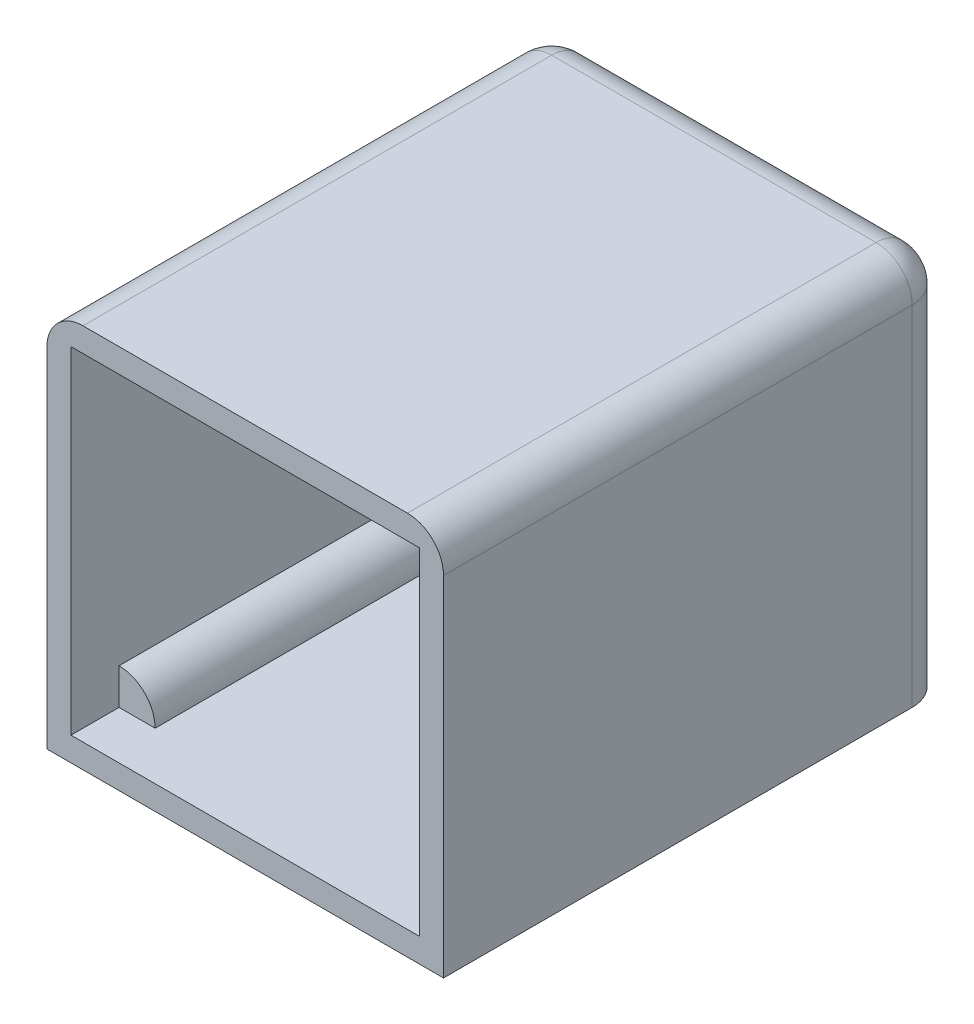
ISO-10303-21;
HEADER;
FILE_DESCRIPTION(('STEP AP214'),'2;1');
FILE_NAME('part.step','',(''),(''),'','','');
FILE_SCHEMA(('AUTOMOTIVE_DESIGN { 1 0 10303 214 1 1 1 1 }'));
ENDSEC;
DATA;
#1=APPLICATION_CONTEXT('core data for automotive mechanical design processes');
#2=APPLICATION_PROTOCOL_DEFINITION('international standard','automotive_design',2000,#1);
#3=PRODUCT_CONTEXT('',#1,'mechanical');
#4=PRODUCT('Part','Part','',(#3));
#5=PRODUCT_RELATED_PRODUCT_CATEGORY('part','',(#4));
#6=PRODUCT_DEFINITION_FORMATION('','',#4);
#7=PRODUCT_DEFINITION_CONTEXT('part definition',#1,'design');
#8=PRODUCT_DEFINITION('design','',#6,#7);
#9=PRODUCT_DEFINITION_SHAPE('','',#8);
#10=(LENGTH_UNIT() NAMED_UNIT(*) SI_UNIT(.MILLI.,.METRE.));
#11=(NAMED_UNIT(*) PLANE_ANGLE_UNIT() SI_UNIT($,.RADIAN.));
#12=(NAMED_UNIT(*) SI_UNIT($,.STERADIAN.) SOLID_ANGLE_UNIT());
#13=UNCERTAINTY_MEASURE_WITH_UNIT(LENGTH_MEASURE(1.E-05),#10,'distance_accuracy_value','');
#14=(GEOMETRIC_REPRESENTATION_CONTEXT(3) GLOBAL_UNCERTAINTY_ASSIGNED_CONTEXT((#13)) GLOBAL_UNIT_ASSIGNED_CONTEXT((#10,
#11,#12)) REPRESENTATION_CONTEXT('',''));
#15=CARTESIAN_POINT('',(0.,0.,0.));
#16=DIRECTION('',(0.,0.,1.));
#17=DIRECTION('',(1.,0.,0.));
#18=AXIS2_PLACEMENT_3D('',#15,#16,#17);
#19=CARTESIAN_POINT('',(-13.0571972328708,0.,1.));
#20=DIRECTION('',(0.,-1.,0.));
#21=DIRECTION('',(0.,0.,-1.));
#22=AXIS2_PLACEMENT_3D('',#19,#20,#21);
#23=CYLINDRICAL_SURFACE('',#22,3.);
#24=CARTESIAN_POINT('',(-13.0571972328708,9.65690552425284,1.));
#25=DIRECTION('',(0.,1.,0.));
#26=DIRECTION('',(0.,0.,1.));
#27=AXIS2_PLACEMENT_3D('',#24,#25,#26);
#28=CIRCLE('',#27,3.);
#29=CARTESIAN_POINT('',(-13.0571972328708,9.65690552425284,-2.));
#30=VERTEX_POINT('',#29);
#31=CARTESIAN_POINT('',(-16.0571972328708,9.65690552425284,1.));
#32=VERTEX_POINT('',#31);
#33=EDGE_CURVE('E12',#30,#32,#28,.T.);
#34=ORIENTED_EDGE('',*,*,#33,.F.);
#35=DIRECTION('',(0.,1.,0.));
#36=VECTOR('',#35,1.);
#37=CARTESIAN_POINT('',(-13.0571972328708,0.,-2.));
#38=LINE('',#37,#36);
#39=CARTESIAN_POINT('',(-13.0571972328708,-19.3430944757472,-2.));
#40=VERTEX_POINT('',#39);
#41=EDGE_CURVE('E298',#40,#30,#38,.T.);
#42=ORIENTED_EDGE('',*,*,#41,.F.);
#43=CARTESIAN_POINT('',(-13.0571972328708,-19.3430944757472,1.));
#44=DIRECTION('',(0.,1.,0.));
#45=DIRECTION('',(0.,0.,1.));
#46=AXIS2_PLACEMENT_3D('',#43,#44,#45);
#47=CIRCLE('',#46,3.);
#48=CARTESIAN_POINT('',(-16.0571972328708,-19.3430944757472,0.999999999999994));
#49=VERTEX_POINT('',#48);
#50=EDGE_CURVE('E52',#49,#40,#47,.F.);
#51=ORIENTED_EDGE('',*,*,#50,.F.);
#52=DIRECTION('',(0.,1.,0.));
#53=VECTOR('',#52,1.);
#54=CARTESIAN_POINT('',(-16.0571972328708,0.,1.));
#55=LINE('',#54,#53);
#56=EDGE_CURVE('E301',#32,#49,#55,.F.);
#57=ORIENTED_EDGE('',*,*,#56,.F.);
#58=EDGE_LOOP('',(#34,#42,#51,#57));
#59=FACE_BOUND('',#58,.T.);
#60=ADVANCED_FACE('F37',(#59),#23,.T.);
#61=CARTESIAN_POINT('',(-13.0571972328708,9.65690552425284,1.));
#62=DIRECTION('',(0.,0.,1.));
#63=DIRECTION('',(1.,0.,0.));
#64=AXIS2_PLACEMENT_3D('',#61,#62,#63);
#65=SPHERICAL_SURFACE('',#64,3.);
#66=CARTESIAN_POINT('',(-13.0571972328708,9.65690552425284,1.));
#67=DIRECTION('',(1.,0.,0.));
#68=DIRECTION('',(0.,0.,-1.));
#69=AXIS2_PLACEMENT_3D('',#66,#67,#68);
#70=CIRCLE('',#69,3.);
#71=CARTESIAN_POINT('',(-13.0571972328708,12.6569055242528,1.));
#72=VERTEX_POINT('',#71);
#73=EDGE_CURVE('E304',#30,#72,#70,.T.);
#74=ORIENTED_EDGE('',*,*,#73,.F.);
#75=ORIENTED_EDGE('',*,*,#33,.T.);
#76=CARTESIAN_POINT('',(-13.0571972328708,9.65690552425284,1.));
#77=DIRECTION('',(0.,0.,1.));
#78=DIRECTION('',(1.,0.,0.));
#79=AXIS2_PLACEMENT_3D('',#76,#77,#78);
#80=CIRCLE('',#79,3.);
#81=EDGE_CURVE('E45',#72,#32,#80,.T.);
#82=ORIENTED_EDGE('',*,*,#81,.F.);
#83=EDGE_LOOP('',(#74,#75,#82));
#84=FACE_BOUND('',#83,.T.);
#85=ADVANCED_FACE('F39',(#84),#65,.T.);
#86=CARTESIAN_POINT('',(13.9428027671292,12.6569055242528,1.));
#87=DIRECTION('',(0.,-1.,0.));
#88=DIRECTION('',(0.,0.,-1.));
#89=AXIS2_PLACEMENT_3D('',#86,#87,#88);
#90=CYLINDRICAL_SURFACE('',#89,3.);
#91=CARTESIAN_POINT('',(13.9428027671292,9.65690552425284,1.));
#92=DIRECTION('',(0.,1.,0.));
#93=DIRECTION('',(0.,0.,1.));
#94=AXIS2_PLACEMENT_3D('',#91,#92,#93);
#95=CIRCLE('',#94,3.);
#96=CARTESIAN_POINT('',(16.9428027671292,9.65690552425284,1.));
#97=VERTEX_POINT('',#96);
#98=CARTESIAN_POINT('',(13.9428027671292,9.65690552425284,-2.));
#99=VERTEX_POINT('',#98);
#100=EDGE_CURVE('E295',#97,#99,#95,.T.);
#101=ORIENTED_EDGE('',*,*,#100,.F.);
#102=DIRECTION('',(0.,1.,0.));
#103=VECTOR('',#102,1.);
#104=CARTESIAN_POINT('',(16.9428027671292,12.6569055242528,1.));
#105=LINE('',#104,#103);
#106=CARTESIAN_POINT('',(16.9428027671292,-19.3430944757472,0.999999999999994));
#107=VERTEX_POINT('',#106);
#108=EDGE_CURVE('E281',#107,#97,#105,.T.);
#109=ORIENTED_EDGE('',*,*,#108,.F.);
#110=CARTESIAN_POINT('',(13.9428027671292,-19.3430944757472,1.));
#111=DIRECTION('',(0.,1.,0.));
#112=DIRECTION('',(0.,0.,1.));
#113=AXIS2_PLACEMENT_3D('',#110,#111,#112);
#114=CIRCLE('',#113,3.);
#115=CARTESIAN_POINT('',(13.9428027671292,-19.3430944757472,-2.));
#116=VERTEX_POINT('',#115);
#117=EDGE_CURVE('E287',#116,#107,#114,.F.);
#118=ORIENTED_EDGE('',*,*,#117,.F.);
#119=DIRECTION('',(0.,1.,0.));
#120=VECTOR('',#119,1.);
#121=CARTESIAN_POINT('',(13.9428027671292,12.6569055242528,-2.));
#122=LINE('',#121,#120);
#123=EDGE_CURVE('E284',#99,#116,#122,.F.);
#124=ORIENTED_EDGE('',*,*,#123,.F.);
#125=EDGE_LOOP('',(#101,#109,#118,#124));
#126=FACE_BOUND('',#125,.T.);
#127=ADVANCED_FACE('F470',(#126),#90,.T.);
#128=CARTESIAN_POINT('',(13.9428027671292,9.65690552425284,1.));
#129=DIRECTION('',(0.,0.,1.));
#130=DIRECTION('',(1.,0.,0.));
#131=AXIS2_PLACEMENT_3D('',#128,#129,#130);
#132=SPHERICAL_SURFACE('',#131,3.);
#133=CARTESIAN_POINT('',(13.9428027671292,9.65690552425284,1.));
#134=DIRECTION('',(0.,0.,-1.));
#135=DIRECTION('',(-1.,0.,0.));
#136=AXIS2_PLACEMENT_3D('',#133,#134,#135);
#137=CIRCLE('',#136,3.);
#138=CARTESIAN_POINT('',(13.9428027671292,12.6569055242528,1.));
#139=VERTEX_POINT('',#138);
#140=EDGE_CURVE('E289',#97,#139,#137,.F.);
#141=ORIENTED_EDGE('',*,*,#140,.F.);
#142=ORIENTED_EDGE('',*,*,#100,.T.);
#143=CARTESIAN_POINT('',(13.9428027671292,9.65690552425284,1.));
#144=DIRECTION('',(1.,0.,0.));
#145=DIRECTION('',(0.,0.,-1.));
#146=AXIS2_PLACEMENT_3D('',#143,#144,#145);
#147=CIRCLE('',#146,3.);
#148=EDGE_CURVE('E292',#139,#99,#147,.F.);
#149=ORIENTED_EDGE('',*,*,#148,.F.);
#150=EDGE_LOOP('',(#141,#142,#149));
#151=FACE_BOUND('',#150,.T.);
#152=ADVANCED_FACE('F472',(#151),#132,.T.);
#153=CARTESIAN_POINT('',(-16.0571972328708,9.65690552425284,1.));
#154=DIRECTION('',(1.,0.,0.));
#155=DIRECTION('',(0.,0.,-1.));
#156=AXIS2_PLACEMENT_3D('',#153,#154,#155);
#157=CYLINDRICAL_SURFACE('',#156,3.);
#158=DIRECTION('',(-1.,0.,0.));
#159=VECTOR('',#158,1.);
#160=CARTESIAN_POINT('',(-16.0571972328708,9.65690552425284,-2.));
#161=LINE('',#160,#159);
#162=EDGE_CURVE('E276',#30,#99,#161,.F.);
#163=ORIENTED_EDGE('',*,*,#162,.F.);
#164=ORIENTED_EDGE('',*,*,#73,.T.);
#165=DIRECTION('',(-1.,0.,0.));
#166=VECTOR('',#165,1.);
#167=CARTESIAN_POINT('',(-16.0571972328708,12.6569055242528,1.));
#168=LINE('',#167,#166);
#169=EDGE_CURVE('E263',#139,#72,#168,.T.);
#170=ORIENTED_EDGE('',*,*,#169,.F.);
#171=ORIENTED_EDGE('',*,*,#148,.T.);
#172=EDGE_LOOP('',(#163,#164,#170,#171));
#173=FACE_BOUND('',#172,.T.);
#174=ADVANCED_FACE('F325',(#173),#157,.T.);
#175=CARTESIAN_POINT('',(13.9428027671292,9.65690552425284,40.));
#176=DIRECTION('',(0.,0.,-1.));
#177=DIRECTION('',(-1.,0.,0.));
#178=AXIS2_PLACEMENT_3D('',#175,#176,#177);
#179=CYLINDRICAL_SURFACE('',#178,3.);
#180=DIRECTION('',(0.,0.,-1.));
#181=VECTOR('',#180,1.);
#182=CARTESIAN_POINT('',(16.9428027671292,9.65690552425284,40.));
#183=LINE('',#182,#181);
#184=CARTESIAN_POINT('',(16.9428027671292,9.65690552425284,40.));
#185=VERTEX_POINT('',#184);
#186=EDGE_CURVE('E269',#97,#185,#183,.F.);
#187=ORIENTED_EDGE('',*,*,#186,.F.);
#188=ORIENTED_EDGE('',*,*,#140,.T.);
#189=DIRECTION('',(0.,0.,-1.));
#190=VECTOR('',#189,1.);
#191=CARTESIAN_POINT('',(13.9428027671292,12.6569055242528,40.));
#192=LINE('',#191,#190);
#193=CARTESIAN_POINT('',(13.9428027671292,12.6569055242528,40.));
#194=VERTEX_POINT('',#193);
#195=EDGE_CURVE('E266',#194,#139,#192,.T.);
#196=ORIENTED_EDGE('',*,*,#195,.F.);
#197=CARTESIAN_POINT('',(13.9428027671292,9.65690552425284,40.));
#198=DIRECTION('',(0.,0.,-1.));
#199=DIRECTION('',(-1.,0.,0.));
#200=AXIS2_PLACEMENT_3D('',#197,#198,#199);
#201=CIRCLE('',#200,3.);
#202=EDGE_CURVE('E274',#185,#194,#201,.F.);
#203=ORIENTED_EDGE('',*,*,#202,.F.);
#204=EDGE_LOOP('',(#187,#188,#196,#203));
#205=FACE_BOUND('',#204,.T.);
#206=ADVANCED_FACE('F481',(#205),#179,.T.);
#207=CARTESIAN_POINT('',(-13.0571972328708,9.65690552425284,40.));
#208=DIRECTION('',(0.,0.,1.));
#209=DIRECTION('',(1.,0.,0.));
#210=AXIS2_PLACEMENT_3D('',#207,#208,#209);
#211=CYLINDRICAL_SURFACE('',#210,3.);
#212=DIRECTION('',(0.,0.,1.));
#213=VECTOR('',#212,1.);
#214=CARTESIAN_POINT('',(-13.0571972328708,12.6569055242528,40.));
#215=LINE('',#214,#213);
#216=CARTESIAN_POINT('',(-13.0571972328708,12.6569055242528,40.));
#217=VERTEX_POINT('',#216);
#218=EDGE_CURVE('E260',#72,#217,#215,.T.);
#219=ORIENTED_EDGE('',*,*,#218,.F.);
#220=ORIENTED_EDGE('',*,*,#81,.T.);
#221=DIRECTION('',(0.,0.,1.));
#222=VECTOR('',#221,1.);
#223=CARTESIAN_POINT('',(-16.0571972328708,9.65690552425284,40.));
#224=LINE('',#223,#222);
#225=CARTESIAN_POINT('',(-16.0571972328708,9.65690552425284,40.));
#226=VERTEX_POINT('',#225);
#227=EDGE_CURVE('E278',#226,#32,#224,.F.);
#228=ORIENTED_EDGE('',*,*,#227,.F.);
#229=CARTESIAN_POINT('',(-13.0571972328708,9.65690552425284,40.));
#230=DIRECTION('',(0.,0.,-1.));
#231=DIRECTION('',(-1.,0.,0.));
#232=AXIS2_PLACEMENT_3D('',#229,#230,#231);
#233=CIRCLE('',#232,3.);
#234=EDGE_CURVE('E271',#217,#226,#233,.F.);
#235=ORIENTED_EDGE('',*,*,#234,.F.);
#236=EDGE_LOOP('',(#219,#220,#228,#235));
#237=FACE_BOUND('',#236,.T.);
#238=ADVANCED_FACE('F308',(#237),#211,.T.);
#239=CARTESIAN_POINT('',(0.,0.,40.));
#240=DIRECTION('',(0.,0.,-1.));
#241=DIRECTION('',(-1.,0.,0.));
#242=AXIS2_PLACEMENT_3D('',#239,#240,#241);
#243=PLANE('',#242);
#244=DIRECTION('',(0.,1.,0.));
#245=VECTOR('',#244,1.);
#246=CARTESIAN_POINT('',(16.9428027671292,12.6569055242528,40.));
#247=LINE('',#246,#245);
#248=CARTESIAN_POINT('',(16.9428027671292,-19.3430944757472,40.));
#249=VERTEX_POINT('',#248);
#250=EDGE_CURVE('E251',#249,#185,#247,.T.);
#251=ORIENTED_EDGE('',*,*,#250,.T.);
#252=ORIENTED_EDGE('',*,*,#202,.T.);
#253=DIRECTION('',(-1.,0.,0.));
#254=VECTOR('',#253,1.);
#255=CARTESIAN_POINT('',(-16.0571972328708,12.6569055242528,40.));
#256=LINE('',#255,#254);
#257=EDGE_CURVE('E244',#194,#217,#256,.T.);
#258=ORIENTED_EDGE('',*,*,#257,.T.);
#259=ORIENTED_EDGE('',*,*,#234,.T.);
#260=DIRECTION('',(0.,-1.,0.));
#261=VECTOR('',#260,1.);
#262=CARTESIAN_POINT('',(-16.0571972328708,12.6569055242528,40.));
#263=LINE('',#262,#261);
#264=CARTESIAN_POINT('',(-16.0571972328708,-19.3430944757472,40.));
#265=VERTEX_POINT('',#264);
#266=EDGE_CURVE('E247',#226,#265,#263,.T.);
#267=ORIENTED_EDGE('',*,*,#266,.T.);
#268=DIRECTION('',(1.,0.,0.));
#269=VECTOR('',#268,1.);
#270=CARTESIAN_POINT('',(-16.0571972328708,-19.3430944757472,40.));
#271=LINE('',#270,#269);
#272=EDGE_CURVE('E249',#265,#249,#271,.T.);
#273=ORIENTED_EDGE('',*,*,#272,.T.);
#274=EDGE_LOOP('',(#251,#252,#258,#259,#267,#273));
#275=FACE_BOUND('',#274,.T.);
#276=DIRECTION('',(0.,-1.,0.));
#277=VECTOR('',#276,1.);
#278=CARTESIAN_POINT('',(-14.0571972328708,10.6569055242528,40.));
#279=LINE('',#278,#277);
#280=CARTESIAN_POINT('',(-14.0571972328708,10.6569055242528,40.));
#281=VERTEX_POINT('',#280);
#282=CARTESIAN_POINT('',(-14.0571972328708,-17.3430944757472,40.));
#283=VERTEX_POINT('',#282);
#284=EDGE_CURVE('E231',#281,#283,#279,.T.);
#285=ORIENTED_EDGE('',*,*,#284,.F.);
#286=DIRECTION('',(-1.,0.,0.));
#287=VECTOR('',#286,1.);
#288=CARTESIAN_POINT('',(-14.0571972328708,10.6569055242528,40.));
#289=LINE('',#288,#287);
#290=CARTESIAN_POINT('',(14.9428027671292,10.6569055242528,40.));
#291=VERTEX_POINT('',#290);
#292=EDGE_CURVE('E236',#291,#281,#289,.T.);
#293=ORIENTED_EDGE('',*,*,#292,.F.);
#294=DIRECTION('',(0.,1.,0.));
#295=VECTOR('',#294,1.);
#296=CARTESIAN_POINT('',(14.9428027671292,10.6569055242528,40.));
#297=LINE('',#296,#295);
#298=CARTESIAN_POINT('',(14.9428027671292,-17.3430944757472,40.));
#299=VERTEX_POINT('',#298);
#300=EDGE_CURVE('E343',#299,#291,#297,.T.);
#301=ORIENTED_EDGE('',*,*,#300,.F.);
#302=DIRECTION('',(1.,0.,0.));
#303=VECTOR('',#302,1.);
#304=CARTESIAN_POINT('',(-14.0571972328708,-17.3430944757472,40.));
#305=LINE('',#304,#303);
#306=EDGE_CURVE('E341',#283,#299,#305,.T.);
#307=ORIENTED_EDGE('',*,*,#306,.F.);
#308=EDGE_LOOP('',(#285,#293,#301,#307));
#309=FACE_BOUND('',#308,.T.);
#310=ADVANCED_FACE('F315',(#275,#309),#243,.F.);
#311=CARTESIAN_POINT('',(-16.0571972328708,12.6569055242528,40.));
#312=DIRECTION('',(0.,-1.,0.));
#313=DIRECTION('',(0.,0.,-1.));
#314=AXIS2_PLACEMENT_3D('',#311,#312,#313);
#315=PLANE('',#314);
#316=ORIENTED_EDGE('',*,*,#257,.F.);
#317=ORIENTED_EDGE('',*,*,#195,.T.);
#318=ORIENTED_EDGE('',*,*,#169,.T.);
#319=ORIENTED_EDGE('',*,*,#218,.T.);
#320=EDGE_LOOP('',(#316,#317,#318,#319));
#321=FACE_BOUND('',#320,.T.);
#322=ADVANCED_FACE('F320',(#321),#315,.F.);
#323=CARTESIAN_POINT('',(-16.0571972328708,12.6569055242528,40.));
#324=DIRECTION('',(1.,0.,0.));
#325=DIRECTION('',(0.,0.,-1.));
#326=AXIS2_PLACEMENT_3D('',#323,#324,#325);
#327=PLANE('',#326);
#328=ORIENTED_EDGE('',*,*,#227,.T.);
#329=ORIENTED_EDGE('',*,*,#56,.T.);
#330=DIRECTION('',(0.,0.,-1.));
#331=VECTOR('',#330,1.);
#332=CARTESIAN_POINT('',(-16.0571972328708,-19.3430944757472,40.));
#333=LINE('',#332,#331);
#334=EDGE_CURVE('E257',#265,#49,#333,.T.);
#335=ORIENTED_EDGE('',*,*,#334,.F.);
#336=ORIENTED_EDGE('',*,*,#266,.F.);
#337=EDGE_LOOP('',(#328,#329,#335,#336));
#338=FACE_BOUND('',#337,.T.);
#339=ADVANCED_FACE('F312',(#338),#327,.F.);
#340=CARTESIAN_POINT('',(-16.0571972328708,-19.3430944757472,40.));
#341=DIRECTION('',(0.,1.,0.));
#342=DIRECTION('',(0.,0.,1.));
#343=AXIS2_PLACEMENT_3D('',#340,#341,#342);
#344=PLANE('',#343);
#345=ORIENTED_EDGE('',*,*,#334,.T.);
#346=ORIENTED_EDGE('',*,*,#50,.T.);
#347=DIRECTION('',(-1.,0.,0.));
#348=VECTOR('',#347,1.);
#349=CARTESIAN_POINT('',(16.9428027671292,-19.3430944757472,-2.));
#350=LINE('',#349,#348);
#351=EDGE_CURVE('E226',#116,#40,#350,.T.);
#352=ORIENTED_EDGE('',*,*,#351,.F.);
#353=ORIENTED_EDGE('',*,*,#117,.T.);
#354=DIRECTION('',(0.,0.,-1.));
#355=VECTOR('',#354,1.);
#356=CARTESIAN_POINT('',(16.9428027671292,-19.3430944757472,40.));
#357=LINE('',#356,#355);
#358=EDGE_CURVE('E254',#249,#107,#357,.T.);
#359=ORIENTED_EDGE('',*,*,#358,.F.);
#360=ORIENTED_EDGE('',*,*,#272,.F.);
#361=EDGE_LOOP('',(#345,#346,#352,#353,#359,#360));
#362=FACE_BOUND('',#361,.T.);
#363=ADVANCED_FACE('F491',(#362),#344,.F.);
#364=CARTESIAN_POINT('',(16.9428027671292,12.6569055242528,40.));
#365=DIRECTION('',(-1.,0.,0.));
#366=DIRECTION('',(0.,0.,1.));
#367=AXIS2_PLACEMENT_3D('',#364,#365,#366);
#368=PLANE('',#367);
#369=ORIENTED_EDGE('',*,*,#358,.T.);
#370=ORIENTED_EDGE('',*,*,#108,.T.);
#371=ORIENTED_EDGE('',*,*,#186,.T.);
#372=ORIENTED_EDGE('',*,*,#250,.F.);
#373=EDGE_LOOP('',(#369,#370,#371,#372));
#374=FACE_BOUND('',#373,.T.);
#375=ADVANCED_FACE('F493',(#374),#368,.F.);
#376=CARTESIAN_POINT('',(-14.0571972328708,10.6569055242528,40.));
#377=DIRECTION('',(1.,0.,0.));
#378=DIRECTION('',(0.,1.,0.));
#379=AXIS2_PLACEMENT_3D('',#376,#377,#378);
#380=PLANE('',#379);
#381=DIRECTION('',(0.,0.,-1.));
#382=VECTOR('',#381,1.);
#383=CARTESIAN_POINT('',(-14.0571972328708,-14.3430944757472,44.2426406871193));
#384=LINE('',#383,#382);
#385=CARTESIAN_POINT('',(-14.0571972328708,-14.3430944757472,36.));
#386=VERTEX_POINT('',#385);
#387=CARTESIAN_POINT('',(-14.0571972328708,-14.3430944757472,0.));
#388=VERTEX_POINT('',#387);
#389=EDGE_CURVE('E382',#386,#388,#384,.T.);
#390=ORIENTED_EDGE('',*,*,#389,.T.);
#391=DIRECTION('',(0.,-1.,0.));
#392=VECTOR('',#391,1.);
#393=CARTESIAN_POINT('',(-14.0571972328708,10.6569055242528,0.));
#394=LINE('',#393,#392);
#395=CARTESIAN_POINT('',(-14.0571972328708,7.65690552425284,0.));
#396=VERTEX_POINT('',#395);
#397=EDGE_CURVE('E222',#396,#388,#394,.T.);
#398=ORIENTED_EDGE('',*,*,#397,.F.);
#399=DIRECTION('',(0.,0.,-1.));
#400=VECTOR('',#399,1.);
#401=CARTESIAN_POINT('',(-14.0571972328708,7.65690552425284,44.2426406871193));
#402=LINE('',#401,#400);
#403=CARTESIAN_POINT('',(-14.0571972328708,7.65690552425284,36.));
#404=VERTEX_POINT('',#403);
#405=EDGE_CURVE('E403',#404,#396,#402,.T.);
#406=ORIENTED_EDGE('',*,*,#405,.F.);
#407=DIRECTION('',(0.,-1.,0.));
#408=VECTOR('',#407,1.);
#409=CARTESIAN_POINT('',(-14.0571972328708,10.6569055242528,36.));
#410=LINE('',#409,#408);
#411=CARTESIAN_POINT('',(-14.0571972328708,10.6569055242528,36.));
#412=VERTEX_POINT('',#411);
#413=EDGE_CURVE('E360',#412,#404,#410,.T.);
#414=ORIENTED_EDGE('',*,*,#413,.F.);
#415=DIRECTION('',(0.,0.,-1.));
#416=VECTOR('',#415,1.);
#417=CARTESIAN_POINT('',(-14.0571972328708,10.6569055242528,40.));
#418=LINE('',#417,#416);
#419=EDGE_CURVE('E232',#281,#412,#418,.T.);
#420=ORIENTED_EDGE('',*,*,#419,.F.);
#421=ORIENTED_EDGE('',*,*,#284,.T.);
#422=DIRECTION('',(0.,0.,-1.));
#423=VECTOR('',#422,1.);
#424=CARTESIAN_POINT('',(-14.0571972328708,-17.3430944757472,40.));
#425=LINE('',#424,#423);
#426=CARTESIAN_POINT('',(-14.0571972328708,-17.3430944757472,36.));
#427=VERTEX_POINT('',#426);
#428=EDGE_CURVE('E241',#283,#427,#425,.T.);
#429=ORIENTED_EDGE('',*,*,#428,.T.);
#430=DIRECTION('',(0.,-1.,0.));
#431=VECTOR('',#430,1.);
#432=CARTESIAN_POINT('',(-14.0571972328708,-17.3430944757472,36.));
#433=LINE('',#432,#431);
#434=EDGE_CURVE('E377',#386,#427,#433,.T.);
#435=ORIENTED_EDGE('',*,*,#434,.F.);
#436=EDGE_LOOP('',(#390,#398,#406,#414,#420,#421,#429,#435));
#437=FACE_BOUND('',#436,.T.);
#438=ADVANCED_FACE('F357',(#437),#380,.T.);
#439=CARTESIAN_POINT('',(-14.0571972328708,-17.3430944757472,40.));
#440=DIRECTION('',(0.,1.,0.));
#441=DIRECTION('',(0.,0.,1.));
#442=AXIS2_PLACEMENT_3D('',#439,#440,#441);
#443=PLANE('',#442);
#444=DIRECTION('',(0.,0.,-1.));
#445=VECTOR('',#444,1.);
#446=CARTESIAN_POINT('',(11.9428027671292,-17.3430944757472,44.2426406871193));
#447=LINE('',#446,#445);
#448=CARTESIAN_POINT('',(11.9428027671292,-17.3430944757472,36.));
#449=VERTEX_POINT('',#448);
#450=CARTESIAN_POINT('',(11.9428027671292,-17.3430944757472,0.));
#451=VERTEX_POINT('',#450);
#452=EDGE_CURVE('E201',#449,#451,#447,.T.);
#453=ORIENTED_EDGE('',*,*,#452,.T.);
#454=DIRECTION('',(1.,0.,0.));
#455=VECTOR('',#454,1.);
#456=CARTESIAN_POINT('',(-14.0571972328708,-17.3430944757472,0.));
#457=LINE('',#456,#455);
#458=CARTESIAN_POINT('',(-11.0571972328708,-17.3430944757472,0.));
#459=VERTEX_POINT('',#458);
#460=EDGE_CURVE('E213',#459,#451,#457,.T.);
#461=ORIENTED_EDGE('',*,*,#460,.F.);
#462=DIRECTION('',(0.,0.,-1.));
#463=VECTOR('',#462,1.);
#464=CARTESIAN_POINT('',(-11.0571972328708,-17.3430944757472,44.2426406871193));
#465=LINE('',#464,#463);
#466=CARTESIAN_POINT('',(-11.0571972328708,-17.3430944757472,36.));
#467=VERTEX_POINT('',#466);
#468=EDGE_CURVE('E378',#467,#459,#465,.T.);
#469=ORIENTED_EDGE('',*,*,#468,.F.);
#470=DIRECTION('',(1.,0.,0.));
#471=VECTOR('',#470,1.);
#472=CARTESIAN_POINT('',(-11.0571972328708,-17.3430944757472,36.));
#473=LINE('',#472,#471);
#474=EDGE_CURVE('E375',#427,#467,#473,.T.);
#475=ORIENTED_EDGE('',*,*,#474,.F.);
#476=ORIENTED_EDGE('',*,*,#428,.F.);
#477=ORIENTED_EDGE('',*,*,#306,.T.);
#478=DIRECTION('',(0.,0.,-1.));
#479=VECTOR('',#478,1.);
#480=CARTESIAN_POINT('',(14.9428027671292,-17.3430944757472,40.));
#481=LINE('',#480,#479);
#482=CARTESIAN_POINT('',(14.9428027671292,-17.3430944757472,36.));
#483=VERTEX_POINT('',#482);
#484=EDGE_CURVE('E239',#299,#483,#481,.T.);
#485=ORIENTED_EDGE('',*,*,#484,.T.);
#486=DIRECTION('',(1.,0.,0.));
#487=VECTOR('',#486,1.);
#488=CARTESIAN_POINT('',(14.9428027671292,-17.3430944757472,36.));
#489=LINE('',#488,#487);
#490=EDGE_CURVE('E215',#449,#483,#489,.T.);
#491=ORIENTED_EDGE('',*,*,#490,.F.);
#492=EDGE_LOOP('',(#453,#461,#469,#475,#476,#477,#485,#491));
#493=FACE_BOUND('',#492,.T.);
#494=ADVANCED_FACE('F211',(#493),#443,.T.);
#495=CARTESIAN_POINT('',(14.9428027671292,10.6569055242528,40.));
#496=DIRECTION('',(-1.,0.,0.));
#497=DIRECTION('',(0.,-1.,0.));
#498=AXIS2_PLACEMENT_3D('',#495,#496,#497);
#499=PLANE('',#498);
#500=DIRECTION('',(0.,0.,-1.));
#501=VECTOR('',#500,1.);
#502=CARTESIAN_POINT('',(14.9428027671292,-14.3430944757472,44.2426406871193));
#503=LINE('',#502,#501);
#504=CARTESIAN_POINT('',(14.9428027671292,-14.3430944757472,36.));
#505=VERTEX_POINT('',#504);
#506=CARTESIAN_POINT('',(14.9428027671292,-14.3430944757472,0.));
#507=VERTEX_POINT('',#506);
#508=EDGE_CURVE('E204',#505,#507,#503,.T.);
#509=ORIENTED_EDGE('',*,*,#508,.F.);
#510=DIRECTION('',(0.,1.,0.));
#511=VECTOR('',#510,1.);
#512=CARTESIAN_POINT('',(14.9428027671292,-14.3430944757472,36.));
#513=LINE('',#512,#511);
#514=EDGE_CURVE('E367',#483,#505,#513,.T.);
#515=ORIENTED_EDGE('',*,*,#514,.F.);
#516=ORIENTED_EDGE('',*,*,#484,.F.);
#517=ORIENTED_EDGE('',*,*,#300,.T.);
#518=DIRECTION('',(0.,0.,-1.));
#519=VECTOR('',#518,1.);
#520=CARTESIAN_POINT('',(14.9428027671292,10.6569055242528,40.));
#521=LINE('',#520,#519);
#522=CARTESIAN_POINT('',(14.9428027671292,10.6569055242528,36.));
#523=VERTEX_POINT('',#522);
#524=EDGE_CURVE('E235',#291,#523,#521,.T.);
#525=ORIENTED_EDGE('',*,*,#524,.T.);
#526=DIRECTION('',(0.,1.,0.));
#527=VECTOR('',#526,1.);
#528=CARTESIAN_POINT('',(14.9428027671292,10.6569055242528,36.));
#529=LINE('',#528,#527);
#530=CARTESIAN_POINT('',(14.9428027671292,7.65690552425284,36.));
#531=VERTEX_POINT('',#530);
#532=EDGE_CURVE('E389',#531,#523,#529,.T.);
#533=ORIENTED_EDGE('',*,*,#532,.F.);
#534=DIRECTION('',(0.,0.,-1.));
#535=VECTOR('',#534,1.);
#536=CARTESIAN_POINT('',(14.9428027671292,7.65690552425284,44.2426406871193));
#537=LINE('',#536,#535);
#538=CARTESIAN_POINT('',(14.9428027671292,7.65690552425284,0.));
#539=VERTEX_POINT('',#538);
#540=EDGE_CURVE('E395',#531,#539,#537,.T.);
#541=ORIENTED_EDGE('',*,*,#540,.T.);
#542=DIRECTION('',(0.,1.,0.));
#543=VECTOR('',#542,1.);
#544=CARTESIAN_POINT('',(14.9428027671292,10.6569055242528,0.));
#545=LINE('',#544,#543);
#546=EDGE_CURVE('E221',#507,#539,#545,.T.);
#547=ORIENTED_EDGE('',*,*,#546,.F.);
#548=EDGE_LOOP('',(#509,#515,#516,#517,#525,#533,#541,#547));
#549=FACE_BOUND('',#548,.T.);
#550=ADVANCED_FACE('F366',(#549),#499,.T.);
#551=CARTESIAN_POINT('',(-14.0571972328708,10.6569055242528,40.));
#552=DIRECTION('',(0.,-1.,0.));
#553=DIRECTION('',(0.,0.,-1.));
#554=AXIS2_PLACEMENT_3D('',#551,#552,#553);
#555=PLANE('',#554);
#556=DIRECTION('',(0.,0.,-1.));
#557=VECTOR('',#556,1.);
#558=CARTESIAN_POINT('',(11.9428027671292,10.6569055242528,44.2426406871193));
#559=LINE('',#558,#557);
#560=CARTESIAN_POINT('',(11.9428027671292,10.6569055242528,36.));
#561=VERTEX_POINT('',#560);
#562=CARTESIAN_POINT('',(11.9428027671292,10.6569055242528,0.));
#563=VERTEX_POINT('',#562);
#564=EDGE_CURVE('E390',#561,#563,#559,.T.);
#565=ORIENTED_EDGE('',*,*,#564,.F.);
#566=DIRECTION('',(-1.,0.,0.));
#567=VECTOR('',#566,1.);
#568=CARTESIAN_POINT('',(11.9428027671292,10.6569055242528,36.));
#569=LINE('',#568,#567);
#570=EDGE_CURVE('E387',#523,#561,#569,.T.);
#571=ORIENTED_EDGE('',*,*,#570,.F.);
#572=ORIENTED_EDGE('',*,*,#524,.F.);
#573=ORIENTED_EDGE('',*,*,#292,.T.);
#574=ORIENTED_EDGE('',*,*,#419,.T.);
#575=DIRECTION('',(-1.,0.,0.));
#576=VECTOR('',#575,1.);
#577=CARTESIAN_POINT('',(-11.0571972328708,10.6569055242528,36.));
#578=LINE('',#577,#576);
#579=CARTESIAN_POINT('',(-11.0571972328708,10.6569055242528,36.));
#580=VERTEX_POINT('',#579);
#581=EDGE_CURVE('E405',#580,#412,#578,.T.);
#582=ORIENTED_EDGE('',*,*,#581,.F.);
#583=DIRECTION('',(0.,0.,-1.));
#584=VECTOR('',#583,1.);
#585=CARTESIAN_POINT('',(-11.0571972328708,10.6569055242528,44.2426406871193));
#586=LINE('',#585,#584);
#587=CARTESIAN_POINT('',(-11.0571972328708,10.6569055242528,0.));
#588=VERTEX_POINT('',#587);
#589=EDGE_CURVE('E408',#580,#588,#586,.T.);
#590=ORIENTED_EDGE('',*,*,#589,.T.);
#591=DIRECTION('',(-1.,0.,0.));
#592=VECTOR('',#591,1.);
#593=CARTESIAN_POINT('',(-14.0571972328708,10.6569055242528,0.));
#594=LINE('',#593,#592);
#595=EDGE_CURVE('E224',#563,#588,#594,.T.);
#596=ORIENTED_EDGE('',*,*,#595,.F.);
#597=EDGE_LOOP('',(#565,#571,#572,#573,#574,#582,#590,#596));
#598=FACE_BOUND('',#597,.T.);
#599=ADVANCED_FACE('F349',(#598),#555,.T.);
#600=CARTESIAN_POINT('',(0.,0.,0.));
#601=DIRECTION('',(0.,0.,-1.));
#602=DIRECTION('',(-1.,0.,0.));
#603=AXIS2_PLACEMENT_3D('',#600,#601,#602);
#604=PLANE('',#603);
#605=DIRECTION('',(-1.,0.,0.));
#606=VECTOR('',#605,1.);
#607=CARTESIAN_POINT('',(5.44280276712922,-13.1617582683491,0.));
#608=LINE('',#607,#606);
#609=CARTESIAN_POINT('',(5.44280276712922,-13.1617582683491,0.));
#610=VERTEX_POINT('',#609);
#611=CARTESIAN_POINT('',(-4.55719723287079,-13.1617582683491,0.));
#612=VERTEX_POINT('',#611);
#613=EDGE_CURVE('E413',#610,#612,#608,.T.);
#614=ORIENTED_EDGE('',*,*,#613,.T.);
#615=DIRECTION('',(0.,1.,0.));
#616=VECTOR('',#615,1.);
#617=CARTESIAN_POINT('',(-4.55719723287079,-10.1617582683491,0.));
#618=LINE('',#617,#616);
#619=CARTESIAN_POINT('',(-4.55719723287079,-10.1617582683491,0.));
#620=VERTEX_POINT('',#619);
#621=EDGE_CURVE('E427',#612,#620,#618,.T.);
#622=ORIENTED_EDGE('',*,*,#621,.T.);
#623=DIRECTION('',(1.,0.,0.));
#624=VECTOR('',#623,1.);
#625=CARTESIAN_POINT('',(5.44280276712922,-10.1617582683491,0.));
#626=LINE('',#625,#624);
#627=CARTESIAN_POINT('',(5.44280276712922,-10.1617582683491,0.));
#628=VERTEX_POINT('',#627);
#629=EDGE_CURVE('E430',#620,#628,#626,.T.);
#630=ORIENTED_EDGE('',*,*,#629,.T.);
#631=DIRECTION('',(0.,-1.,0.));
#632=VECTOR('',#631,1.);
#633=CARTESIAN_POINT('',(5.44280276712922,-13.1617582683491,0.));
#634=LINE('',#633,#632);
#635=EDGE_CURVE('E417',#628,#610,#634,.T.);
#636=ORIENTED_EDGE('',*,*,#635,.T.);
#637=EDGE_LOOP('',(#614,#622,#630,#636));
#638=FACE_BOUND('',#637,.T.);
#639=ORIENTED_EDGE('',*,*,#460,.T.);
#640=CARTESIAN_POINT('',(14.9428027671292,-17.3430944757472,0.));
#641=DIRECTION('',(0.,0.,-1.));
#642=DIRECTION('',(1.,0.,0.));
#643=AXIS2_PLACEMENT_3D('',#640,#641,#642);
#644=CIRCLE('',#643,3.);
#645=EDGE_CURVE('E197',#451,#507,#644,.T.);
#646=ORIENTED_EDGE('',*,*,#645,.T.);
#647=ORIENTED_EDGE('',*,*,#546,.T.);
#648=CARTESIAN_POINT('',(14.9428027671292,10.6569055242528,0.));
#649=DIRECTION('',(0.,0.,-1.));
#650=DIRECTION('',(1.,0.,0.));
#651=AXIS2_PLACEMENT_3D('',#648,#649,#650);
#652=CIRCLE('',#651,3.);
#653=EDGE_CURVE('E386',#539,#563,#652,.T.);
#654=ORIENTED_EDGE('',*,*,#653,.T.);
#655=ORIENTED_EDGE('',*,*,#595,.T.);
#656=CARTESIAN_POINT('',(-14.0571972328708,10.6569055242528,0.));
#657=DIRECTION('',(0.,0.,-1.));
#658=DIRECTION('',(-1.,0.,0.));
#659=AXIS2_PLACEMENT_3D('',#656,#657,#658);
#660=CIRCLE('',#659,3.);
#661=EDGE_CURVE('E400',#588,#396,#660,.T.);
#662=ORIENTED_EDGE('',*,*,#661,.T.);
#663=ORIENTED_EDGE('',*,*,#397,.T.);
#664=CARTESIAN_POINT('',(-14.0571972328708,-17.3430944757472,0.));
#665=DIRECTION('',(0.,0.,-1.));
#666=DIRECTION('',(-1.,0.,0.));
#667=AXIS2_PLACEMENT_3D('',#664,#665,#666);
#668=CIRCLE('',#667,3.);
#669=EDGE_CURVE('E220',#388,#459,#668,.T.);
#670=ORIENTED_EDGE('',*,*,#669,.T.);
#671=EDGE_LOOP('',(#639,#646,#647,#654,#655,#662,#663,#670));
#672=FACE_BOUND('',#671,.T.);
#673=ADVANCED_FACE('F218',(#638,#672),#604,.F.);
#674=CARTESIAN_POINT('',(0.,0.,-2.));
#675=DIRECTION('',(0.,0.,-1.));
#676=DIRECTION('',(-1.,0.,0.));
#677=AXIS2_PLACEMENT_3D('',#674,#675,#676);
#678=PLANE('',#677);
#679=ORIENTED_EDGE('',*,*,#351,.T.);
#680=ORIENTED_EDGE('',*,*,#41,.T.);
#681=ORIENTED_EDGE('',*,*,#162,.T.);
#682=ORIENTED_EDGE('',*,*,#123,.T.);
#683=EDGE_LOOP('',(#679,#680,#681,#682));
#684=FACE_BOUND('',#683,.T.);
#685=DIRECTION('',(0.,1.,0.));
#686=VECTOR('',#685,1.);
#687=CARTESIAN_POINT('',(-4.55719723287079,-10.1617582683491,-2.));
#688=LINE('',#687,#686);
#689=CARTESIAN_POINT('',(-4.55719723287079,-13.1617582683491,-2.));
#690=VERTEX_POINT('',#689);
#691=CARTESIAN_POINT('',(-4.55719723287079,-10.1617582683491,-2.));
#692=VERTEX_POINT('',#691);
#693=EDGE_CURVE('E416',#690,#692,#688,.T.);
#694=ORIENTED_EDGE('',*,*,#693,.F.);
#695=DIRECTION('',(-1.,0.,0.));
#696=VECTOR('',#695,1.);
#697=CARTESIAN_POINT('',(5.44280276712922,-13.1617582683491,-2.));
#698=LINE('',#697,#696);
#699=CARTESIAN_POINT('',(5.44280276712922,-13.1617582683491,-2.));
#700=VERTEX_POINT('',#699);
#701=EDGE_CURVE('E414',#700,#690,#698,.T.);
#702=ORIENTED_EDGE('',*,*,#701,.F.);
#703=DIRECTION('',(0.,-1.,0.));
#704=VECTOR('',#703,1.);
#705=CARTESIAN_POINT('',(5.44280276712922,-13.1617582683491,-2.));
#706=LINE('',#705,#704);
#707=CARTESIAN_POINT('',(5.44280276712922,-10.1617582683491,-2.));
#708=VERTEX_POINT('',#707);
#709=EDGE_CURVE('E422',#708,#700,#706,.T.);
#710=ORIENTED_EDGE('',*,*,#709,.F.);
#711=DIRECTION('',(1.,0.,0.));
#712=VECTOR('',#711,1.);
#713=CARTESIAN_POINT('',(5.44280276712922,-10.1617582683491,-2.));
#714=LINE('',#713,#712);
#715=EDGE_CURVE('E419',#692,#708,#714,.T.);
#716=ORIENTED_EDGE('',*,*,#715,.F.);
#717=EDGE_LOOP('',(#694,#702,#710,#716));
#718=FACE_BOUND('',#717,.T.);
#719=ADVANCED_FACE('F329',(#684,#718),#678,.T.);
#720=CARTESIAN_POINT('',(5.44280276712922,-13.1617582683491,-2.));
#721=DIRECTION('',(0.,1.,0.));
#722=DIRECTION('',(0.,0.,1.));
#723=AXIS2_PLACEMENT_3D('',#720,#721,#722);
#724=PLANE('',#723);
#725=ORIENTED_EDGE('',*,*,#613,.F.);
#726=DIRECTION('',(0.,0.,1.));
#727=VECTOR('',#726,1.);
#728=CARTESIAN_POINT('',(5.44280276712922,-13.1617582683491,-2.));
#729=LINE('',#728,#727);
#730=EDGE_CURVE('E424',#700,#610,#729,.T.);
#731=ORIENTED_EDGE('',*,*,#730,.F.);
#732=ORIENTED_EDGE('',*,*,#701,.T.);
#733=DIRECTION('',(0.,0.,1.));
#734=VECTOR('',#733,1.);
#735=CARTESIAN_POINT('',(-4.55719723287079,-13.1617582683491,-2.));
#736=LINE('',#735,#734);
#737=EDGE_CURVE('E333',#690,#612,#736,.T.);
#738=ORIENTED_EDGE('',*,*,#737,.T.);
#739=EDGE_LOOP('',(#725,#731,#732,#738));
#740=FACE_BOUND('',#739,.T.);
#741=ADVANCED_FACE('F451',(#740),#724,.T.);
#742=CARTESIAN_POINT('',(-4.55719723287079,-10.1617582683491,-2.));
#743=DIRECTION('',(1.,0.,0.));
#744=DIRECTION('',(0.,0.,-1.));
#745=AXIS2_PLACEMENT_3D('',#742,#743,#744);
#746=PLANE('',#745);
#747=ORIENTED_EDGE('',*,*,#621,.F.);
#748=ORIENTED_EDGE('',*,*,#737,.F.);
#749=ORIENTED_EDGE('',*,*,#693,.T.);
#750=DIRECTION('',(0.,0.,1.));
#751=VECTOR('',#750,1.);
#752=CARTESIAN_POINT('',(-4.55719723287079,-10.1617582683491,-2.));
#753=LINE('',#752,#751);
#754=EDGE_CURVE('E336',#692,#620,#753,.T.);
#755=ORIENTED_EDGE('',*,*,#754,.T.);
#756=EDGE_LOOP('',(#747,#748,#749,#755));
#757=FACE_BOUND('',#756,.T.);
#758=ADVANCED_FACE('F441',(#757),#746,.T.);
#759=CARTESIAN_POINT('',(5.44280276712922,-10.1617582683491,-2.));
#760=DIRECTION('',(0.,-1.,0.));
#761=DIRECTION('',(0.,0.,-1.));
#762=AXIS2_PLACEMENT_3D('',#759,#760,#761);
#763=PLANE('',#762);
#764=ORIENTED_EDGE('',*,*,#629,.F.);
#765=ORIENTED_EDGE('',*,*,#754,.F.);
#766=ORIENTED_EDGE('',*,*,#715,.T.);
#767=DIRECTION('',(0.,0.,1.));
#768=VECTOR('',#767,1.);
#769=CARTESIAN_POINT('',(5.44280276712922,-10.1617582683491,-2.));
#770=LINE('',#769,#768);
#771=EDGE_CURVE('E437',#708,#628,#770,.T.);
#772=ORIENTED_EDGE('',*,*,#771,.T.);
#773=EDGE_LOOP('',(#764,#765,#766,#772));
#774=FACE_BOUND('',#773,.T.);
#775=ADVANCED_FACE('F446',(#774),#763,.T.);
#776=CARTESIAN_POINT('',(5.44280276712922,-13.1617582683491,-2.));
#777=DIRECTION('',(-1.,0.,0.));
#778=DIRECTION('',(0.,0.,1.));
#779=AXIS2_PLACEMENT_3D('',#776,#777,#778);
#780=PLANE('',#779);
#781=ORIENTED_EDGE('',*,*,#635,.F.);
#782=ORIENTED_EDGE('',*,*,#771,.F.);
#783=ORIENTED_EDGE('',*,*,#709,.T.);
#784=ORIENTED_EDGE('',*,*,#730,.T.);
#785=EDGE_LOOP('',(#781,#782,#783,#784));
#786=FACE_BOUND('',#785,.T.);
#787=ADVANCED_FACE('F454',(#786),#780,.T.);
#788=CARTESIAN_POINT('',(-14.0571972328708,10.6569055242528,44.2426406871193));
#789=DIRECTION('',(0.,0.,-1.));
#790=DIRECTION('',(-1.,0.,0.));
#791=AXIS2_PLACEMENT_3D('',#788,#789,#790);
#792=CYLINDRICAL_SURFACE('',#791,3.);
#793=CARTESIAN_POINT('',(-14.0571972328708,10.6569055242528,36.));
#794=DIRECTION('',(0.,0.,-1.));
#795=DIRECTION('',(-1.,0.,0.));
#796=AXIS2_PLACEMENT_3D('',#793,#794,#795);
#797=CIRCLE('',#796,3.);
#798=EDGE_CURVE('E401',#404,#580,#797,.F.);
#799=ORIENTED_EDGE('',*,*,#798,.F.);
#800=ORIENTED_EDGE('',*,*,#405,.T.);
#801=ORIENTED_EDGE('',*,*,#661,.F.);
#802=ORIENTED_EDGE('',*,*,#589,.F.);
#803=EDGE_LOOP('',(#799,#800,#801,#802));
#804=FACE_BOUND('',#803,.T.);
#805=ADVANCED_FACE('F517',(#804),#792,.T.);
#806=CARTESIAN_POINT('',(0.,0.,36.));
#807=DIRECTION('',(0.,0.,-1.));
#808=DIRECTION('',(-1.,0.,0.));
#809=AXIS2_PLACEMENT_3D('',#806,#807,#808);
#810=PLANE('',#809);
#811=ORIENTED_EDGE('',*,*,#413,.T.);
#812=ORIENTED_EDGE('',*,*,#798,.T.);
#813=ORIENTED_EDGE('',*,*,#581,.T.);
#814=EDGE_LOOP('',(#811,#812,#813));
#815=FACE_BOUND('',#814,.T.);
#816=ADVANCED_FACE('F522',(#815),#810,.F.);
#817=CARTESIAN_POINT('',(14.9428027671292,10.6569055242528,44.2426406871193));
#818=DIRECTION('',(0.,0.,-1.));
#819=DIRECTION('',(-1.,0.,0.));
#820=AXIS2_PLACEMENT_3D('',#817,#818,#819);
#821=CYLINDRICAL_SURFACE('',#820,3.);
#822=CARTESIAN_POINT('',(14.9428027671292,10.6569055242528,36.));
#823=DIRECTION('',(0.,0.,-1.));
#824=DIRECTION('',(-1.,0.,0.));
#825=AXIS2_PLACEMENT_3D('',#822,#823,#824);
#826=CIRCLE('',#825,3.);
#827=EDGE_CURVE('E392',#561,#531,#826,.F.);
#828=ORIENTED_EDGE('',*,*,#827,.F.);
#829=ORIENTED_EDGE('',*,*,#564,.T.);
#830=ORIENTED_EDGE('',*,*,#653,.F.);
#831=ORIENTED_EDGE('',*,*,#540,.F.);
#832=EDGE_LOOP('',(#828,#829,#830,#831));
#833=FACE_BOUND('',#832,.T.);
#834=ADVANCED_FACE('F533',(#833),#821,.T.);
#835=CARTESIAN_POINT('',(0.,0.,36.));
#836=DIRECTION('',(0.,0.,-1.));
#837=DIRECTION('',(-1.,0.,0.));
#838=AXIS2_PLACEMENT_3D('',#835,#836,#837);
#839=PLANE('',#838);
#840=ORIENTED_EDGE('',*,*,#532,.T.);
#841=ORIENTED_EDGE('',*,*,#570,.T.);
#842=ORIENTED_EDGE('',*,*,#827,.T.);
#843=EDGE_LOOP('',(#840,#841,#842));
#844=FACE_BOUND('',#843,.T.);
#845=ADVANCED_FACE('F543',(#844),#839,.F.);
#846=CARTESIAN_POINT('',(-14.0571972328708,-17.3430944757472,44.2426406871193));
#847=DIRECTION('',(0.,0.,-1.));
#848=DIRECTION('',(-1.,0.,0.));
#849=AXIS2_PLACEMENT_3D('',#846,#847,#848);
#850=CYLINDRICAL_SURFACE('',#849,3.);
#851=CARTESIAN_POINT('',(-14.0571972328708,-17.3430944757472,36.));
#852=DIRECTION('',(0.,0.,-1.));
#853=DIRECTION('',(-1.,0.,0.));
#854=AXIS2_PLACEMENT_3D('',#851,#852,#853);
#855=CIRCLE('',#854,3.);
#856=EDGE_CURVE('E380',#467,#386,#855,.F.);
#857=ORIENTED_EDGE('',*,*,#856,.F.);
#858=ORIENTED_EDGE('',*,*,#468,.T.);
#859=ORIENTED_EDGE('',*,*,#669,.F.);
#860=ORIENTED_EDGE('',*,*,#389,.F.);
#861=EDGE_LOOP('',(#857,#858,#859,#860));
#862=FACE_BOUND('',#861,.T.);
#863=ADVANCED_FACE('F553',(#862),#850,.T.);
#864=CARTESIAN_POINT('',(0.,0.,36.));
#865=DIRECTION('',(0.,0.,-1.));
#866=DIRECTION('',(-1.,0.,0.));
#867=AXIS2_PLACEMENT_3D('',#864,#865,#866);
#868=PLANE('',#867);
#869=ORIENTED_EDGE('',*,*,#434,.T.);
#870=ORIENTED_EDGE('',*,*,#474,.T.);
#871=ORIENTED_EDGE('',*,*,#856,.T.);
#872=EDGE_LOOP('',(#869,#870,#871));
#873=FACE_BOUND('',#872,.T.);
#874=ADVANCED_FACE('F563',(#873),#868,.F.);
#875=CARTESIAN_POINT('',(14.9428027671292,-17.3430944757472,44.2426406871193));
#876=DIRECTION('',(0.,0.,-1.));
#877=DIRECTION('',(-1.,0.,0.));
#878=AXIS2_PLACEMENT_3D('',#875,#876,#877);
#879=CYLINDRICAL_SURFACE('',#878,3.);
#880=CARTESIAN_POINT('',(14.9428027671292,-17.3430944757472,36.));
#881=DIRECTION('',(0.,0.,-1.));
#882=DIRECTION('',(-1.,0.,0.));
#883=AXIS2_PLACEMENT_3D('',#880,#881,#882);
#884=CIRCLE('',#883,3.);
#885=EDGE_CURVE('E370',#505,#449,#884,.F.);
#886=ORIENTED_EDGE('',*,*,#885,.F.);
#887=ORIENTED_EDGE('',*,*,#508,.T.);
#888=ORIENTED_EDGE('',*,*,#645,.F.);
#889=ORIENTED_EDGE('',*,*,#452,.F.);
#890=EDGE_LOOP('',(#886,#887,#888,#889));
#891=FACE_BOUND('',#890,.T.);
#892=ADVANCED_FACE('F200',(#891),#879,.T.);
#893=CARTESIAN_POINT('',(0.,0.,36.));
#894=DIRECTION('',(0.,0.,-1.));
#895=DIRECTION('',(-1.,0.,0.));
#896=AXIS2_PLACEMENT_3D('',#893,#894,#895);
#897=PLANE('',#896);
#898=ORIENTED_EDGE('',*,*,#490,.T.);
#899=ORIENTED_EDGE('',*,*,#514,.T.);
#900=ORIENTED_EDGE('',*,*,#885,.T.);
#901=EDGE_LOOP('',(#898,#899,#900));
#902=FACE_BOUND('',#901,.T.);
#903=ADVANCED_FACE('F582',(#902),#897,.F.);
#904=CLOSED_SHELL('',(#60,#85,#127,#152,#174,#206,#238,#310,#322,#339,#363,#375,#438,#494,#550,
#599,#673,#719,#741,#758,#775,#787,#805,#816,#834,#845,#863,#874,#892,#903));
#905=MANIFOLD_SOLID_BREP('B2',#904);
#906=ADVANCED_BREP_SHAPE_REPRESENTATION('',(#18,#905),#14);
#907=SHAPE_DEFINITION_REPRESENTATION(#9,#906);
ENDSEC;
END-ISO-10303-21;
